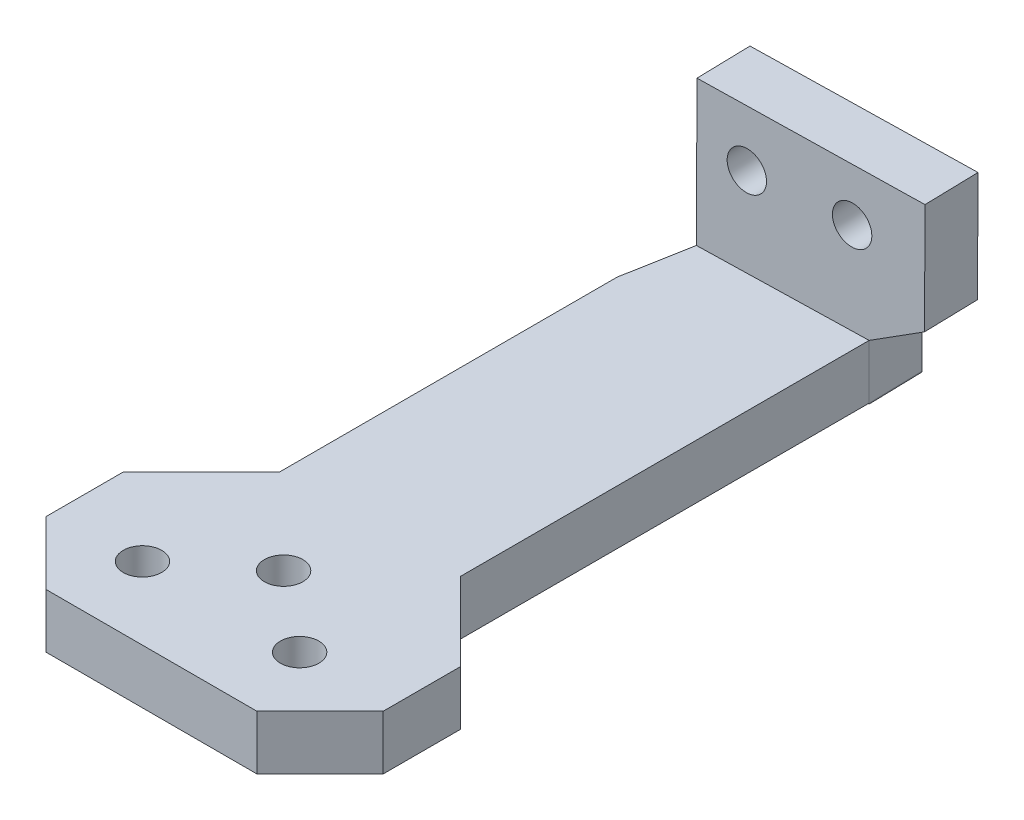
ISO-10303-21;
HEADER;
FILE_DESCRIPTION(('STEP AP214'),'2;1');
FILE_NAME('part.step','',(''),(''),'','','');
FILE_SCHEMA(('AUTOMOTIVE_DESIGN { 1 0 10303 214 1 1 1 1 }'));
ENDSEC;
DATA;
#1=APPLICATION_CONTEXT('core data for automotive mechanical design processes');
#2=APPLICATION_PROTOCOL_DEFINITION('international standard','automotive_design',2000,#1);
#3=PRODUCT_CONTEXT('',#1,'mechanical');
#4=PRODUCT('Part','Part','',(#3));
#5=PRODUCT_RELATED_PRODUCT_CATEGORY('part','',(#4));
#6=PRODUCT_DEFINITION_FORMATION('','',#4);
#7=PRODUCT_DEFINITION_CONTEXT('part definition',#1,'design');
#8=PRODUCT_DEFINITION('design','',#6,#7);
#9=PRODUCT_DEFINITION_SHAPE('','',#8);
#10=(LENGTH_UNIT() NAMED_UNIT(*) SI_UNIT(.MILLI.,.METRE.));
#11=(NAMED_UNIT(*) PLANE_ANGLE_UNIT() SI_UNIT($,.RADIAN.));
#12=(NAMED_UNIT(*) SI_UNIT($,.STERADIAN.) SOLID_ANGLE_UNIT());
#13=UNCERTAINTY_MEASURE_WITH_UNIT(LENGTH_MEASURE(1.E-05),#10,'distance_accuracy_value','');
#14=(GEOMETRIC_REPRESENTATION_CONTEXT(3) GLOBAL_UNCERTAINTY_ASSIGNED_CONTEXT((#13)) GLOBAL_UNIT_ASSIGNED_CONTEXT((#10,
#11,#12)) REPRESENTATION_CONTEXT('',''));
#15=CARTESIAN_POINT('',(0.,0.,0.));
#16=DIRECTION('',(0.,0.,1.));
#17=DIRECTION('',(1.,0.,0.));
#18=AXIS2_PLACEMENT_3D('',#15,#16,#17);
#19=CARTESIAN_POINT('',(0.5975916541765,0.,24.3393126845238));
#20=DIRECTION('',(-0.0245451308027947,0.,-0.999698722892989));
#21=DIRECTION('',(-0.999698722892989,0.,0.0245451308027947));
#22=AXIS2_PLACEMENT_3D('',#19,#20,#21);
#23=PLANE('',#22);
#24=CARTESIAN_POINT('',(-3.38225333063673,16.7282372679157,24.4370279396203));
#25=DIRECTION('',(0.0245451308027946,0.,0.999698722892989));
#26=DIRECTION('',(0.999698722892989,0.,-0.0245451308027946));
#27=AXIS2_PLACEMENT_3D('',#24,#25,#26);
#28=CIRCLE('',#27,2.24790000000673);
#29=CARTESIAN_POINT('',(-1.13503057143885,16.7282372679157,24.3818529400885));
#30=VERTEX_POINT('',#29);
#31=EDGE_CURVE('E403',#30,#30,#28,.T.);
#32=ORIENTED_EDGE('',*,*,#31,.F.);
#33=EDGE_LOOP('',(#32));
#34=FACE_BOUND('',#33,.T.);
#35=CARTESIAN_POINT('',(8.62803223379969,17.0846353252613,24.1421450680038));
#36=DIRECTION('',(0.0245451308027946,0.,0.999698722892989));
#37=DIRECTION('',(0.999698722892989,0.,-0.0245451308027946));
#38=AXIS2_PLACEMENT_3D('',#35,#36,#37);
#39=CIRCLE('',#38,2.24790000000672);
#40=CARTESIAN_POINT('',(10.8752549929976,17.0846353252613,24.086970068472));
#41=VERTEX_POINT('',#40);
#42=EDGE_CURVE('E406',#41,#41,#39,.T.);
#43=ORIENTED_EDGE('',*,*,#42,.F.);
#44=EDGE_LOOP('',(#43));
#45=FACE_BOUND('',#44,.T.);
#46=DIRECTION('',(-0.999698722892989,0.,0.0245451308027947));
#47=VECTOR('',#46,1.);
#48=CARTESIAN_POINT('',(0.597591654176501,6.35,24.3393126845238));
#49=LINE('',#48,#47);
#50=CARTESIAN_POINT('',(10.5664845459525,6.35,24.0945511634932));
#51=VERTEX_POINT('',#50);
#52=CARTESIAN_POINT('',(-9.14070594421671,6.35,24.578412508176));
#53=VERTEX_POINT('',#52);
#54=EDGE_CURVE('E200',#51,#53,#49,.T.);
#55=ORIENTED_EDGE('',*,*,#54,.F.);
#56=DIRECTION('',(-0.847962118438704,-0.529647797487237,0.0208196135858428));
#57=VECTOR('',#56,1.);
#58=CARTESIAN_POINT('',(10.5664845459525,6.35,24.0945511634932));
#59=LINE('',#58,#57);
#60=CARTESIAN_POINT('',(16.8839683571341,10.2959797949635,23.9394409658515));
#61=VERTEX_POINT('',#60);
#62=EDGE_CURVE('E168',#61,#51,#59,.T.);
#63=ORIENTED_EDGE('',*,*,#62,.F.);
#64=DIRECTION('',(0.00439645934331877,0.99999032969989,-0.000107944190764413));
#65=VECTOR('',#64,1.);
#66=CARTESIAN_POINT('',(16.9407170912385,23.203681401112,23.9380476409732));
#67=LINE('',#66,#65);
#68=CARTESIAN_POINT('',(16.9407170912385,23.203681401112,23.9380476409732));
#69=VERTEX_POINT('',#68);
#70=EDGE_CURVE('E305',#61,#69,#67,.T.);
#71=ORIENTED_EDGE('',*,*,#70,.T.);
#72=DIRECTION('',(-0.999689055506319,0.00439778429504862,0.0245448934440134));
#73=VECTOR('',#72,1.);
#74=CARTESIAN_POINT('',(16.9407170912385,23.203681401112,23.9380476409732));
#75=LINE('',#74,#73);
#76=CARTESIAN_POINT('',(-9.06610570774999,23.3180893725102,24.5765808837876));
#77=VERTEX_POINT('',#76);
#78=EDGE_CURVE('E373',#69,#77,#75,.T.);
#79=ORIENTED_EDGE('',*,*,#78,.T.);
#80=DIRECTION('',(-0.00439645934331877,-0.99999032969989,0.000107944190764562));
#81=VECTOR('',#80,1.);
#82=CARTESIAN_POINT('',(-9.06610570774999,23.3180893725102,24.5765808837876));
#83=LINE('',#82,#81);
#84=EDGE_CURVE('E288',#77,#53,#83,.T.);
#85=ORIENTED_EDGE('',*,*,#84,.T.);
#86=EDGE_LOOP('',(#55,#63,#71,#79,#85));
#87=FACE_BOUND('',#86,.T.);
#88=ADVANCED_FACE('F39',(#34,#45,#87),#23,.F.);
#89=CARTESIAN_POINT('',(0.,6.35,0.));
#90=DIRECTION('',(0.,1.,0.));
#91=DIRECTION('',(0.,0.,1.));
#92=AXIS2_PLACEMENT_3D('',#89,#90,#91);
#93=PLANE('',#92);
#94=DIRECTION('',(0.179140165281254,0.,-0.98382356201862));
#95=VECTOR('',#94,1.);
#96=CARTESIAN_POINT('',(-9.14070594421671,6.35,24.578412508176));
#97=LINE('',#96,#95);
#98=CARTESIAN_POINT('',(-10.5664845459524,6.35,32.4086753663532));
#99=VERTEX_POINT('',#98);
#100=EDGE_CURVE('E350',#99,#53,#97,.T.);
#101=ORIENTED_EDGE('',*,*,#100,.F.);
#102=DIRECTION('',(0.,0.,1.));
#103=VECTOR('',#102,1.);
#104=CARTESIAN_POINT('',(-10.5664845459524,6.35,21.8784368138053));
#105=LINE('',#104,#103);
#106=CARTESIAN_POINT('',(-10.5664845459524,6.35,71.843509550559));
#107=VERTEX_POINT('',#106);
#108=EDGE_CURVE('E216',#99,#107,#105,.T.);
#109=ORIENTED_EDGE('',*,*,#108,.T.);
#110=DIRECTION('',(-0.707106781186548,0.,0.707106781186547));
#111=VECTOR('',#110,1.);
#112=CARTESIAN_POINT('',(-10.5664845459524,6.35,71.843509550559));
#113=LINE('',#112,#111);
#114=CARTESIAN_POINT('',(-19.6998793715268,6.35,80.9769043761334));
#115=VERTEX_POINT('',#114);
#116=EDGE_CURVE('E218',#107,#115,#113,.T.);
#117=ORIENTED_EDGE('',*,*,#116,.T.);
#118=DIRECTION('',(0.,0.,1.));
#119=VECTOR('',#118,1.);
#120=CARTESIAN_POINT('',(-19.6998793715268,6.35,-14.5616917387912));
#121=LINE('',#120,#119);
#122=CARTESIAN_POINT('',(-19.6998793715268,6.35,90.0191075086382));
#123=VERTEX_POINT('',#122);
#124=EDGE_CURVE('E267',#115,#123,#121,.T.);
#125=ORIENTED_EDGE('',*,*,#124,.T.);
#126=DIRECTION('',(0.707106781186548,0.,0.707106781186548));
#127=VECTOR('',#126,1.);
#128=CARTESIAN_POINT('',(-12.3270420752059,6.35,97.3919448049591));
#129=LINE('',#128,#127);
#130=CARTESIAN_POINT('',(-12.3270420752059,6.35,97.3919448049591));
#131=VERTEX_POINT('',#130);
#132=EDGE_CURVE('E221',#123,#131,#129,.T.);
#133=ORIENTED_EDGE('',*,*,#132,.T.);
#134=DIRECTION('',(1.,0.,0.));
#135=VECTOR('',#134,1.);
#136=CARTESIAN_POINT('',(-19.6998793715268,6.35,97.3919448049591));
#137=LINE('',#136,#135);
#138=CARTESIAN_POINT('',(12.3270420752059,6.35,97.3919448049591));
#139=VERTEX_POINT('',#138);
#140=EDGE_CURVE('E270',#131,#139,#137,.T.);
#141=ORIENTED_EDGE('',*,*,#140,.T.);
#142=DIRECTION('',(0.707106781186547,0.,-0.707106781186548));
#143=VECTOR('',#142,1.);
#144=CARTESIAN_POINT('',(12.3270420752059,6.35,97.3919448049591));
#145=LINE('',#144,#143);
#146=CARTESIAN_POINT('',(19.6998793715268,6.35,90.0191075086382));
#147=VERTEX_POINT('',#146);
#148=EDGE_CURVE('E224',#139,#147,#145,.T.);
#149=ORIENTED_EDGE('',*,*,#148,.T.);
#150=DIRECTION('',(0.,0.,-1.));
#151=VECTOR('',#150,1.);
#152=CARTESIAN_POINT('',(19.6998793715268,6.35,-14.5616917387912));
#153=LINE('',#152,#151);
#154=CARTESIAN_POINT('',(19.6998793715268,6.35,80.9769043761334));
#155=VERTEX_POINT('',#154);
#156=EDGE_CURVE('E181',#147,#155,#153,.T.);
#157=ORIENTED_EDGE('',*,*,#156,.T.);
#158=DIRECTION('',(-0.707106781186547,0.,-0.707106781186548));
#159=VECTOR('',#158,1.);
#160=CARTESIAN_POINT('',(19.6998793715268,6.35,80.9769043761334));
#161=LINE('',#160,#159);
#162=CARTESIAN_POINT('',(10.5664845459524,6.35,71.843509550559));
#163=VERTEX_POINT('',#162);
#164=EDGE_CURVE('E227',#155,#163,#161,.T.);
#165=ORIENTED_EDGE('',*,*,#164,.T.);
#166=DIRECTION('',(0.,0.,-1.));
#167=VECTOR('',#166,1.);
#168=CARTESIAN_POINT('',(10.5664845459524,6.35,71.843509550559));
#169=LINE('',#168,#167);
#170=EDGE_CURVE('E230',#163,#51,#169,.T.);
#171=ORIENTED_EDGE('',*,*,#170,.T.);
#172=ORIENTED_EDGE('',*,*,#54,.T.);
#173=EDGE_LOOP('',(#101,#109,#117,#125,#133,#141,#149,#157,#165,#171,#172));
#174=FACE_BOUND('',#173,.T.);
#175=CARTESIAN_POINT('',(8.83739968952087,6.35,88.9179733151553));
#176=DIRECTION('',(0.,-1.,0.));
#177=DIRECTION('',(0.,0.,-1.));
#178=AXIS2_PLACEMENT_3D('',#175,#176,#177);
#179=CIRCLE('',#178,2.2479);
#180=CARTESIAN_POINT('',(8.83739968952087,6.35,86.6700733151553));
#181=VERTEX_POINT('',#180);
#182=EDGE_CURVE('E256',#181,#181,#179,.T.);
#183=ORIENTED_EDGE('',*,*,#182,.T.);
#184=EDGE_LOOP('',(#183));
#185=FACE_BOUND('',#184,.T.);
#186=CARTESIAN_POINT('',(-0.345903119202115,6.35,81.6070978447811));
#187=DIRECTION('',(0.,-1.,0.));
#188=DIRECTION('',(0.,0.,-1.));
#189=AXIS2_PLACEMENT_3D('',#186,#187,#188);
#190=CIRCLE('',#189,2.2479);
#191=CARTESIAN_POINT('',(-0.345903119202115,6.35,79.3591978447811));
#192=VERTEX_POINT('',#191);
#193=EDGE_CURVE('E249',#192,#192,#190,.T.);
#194=ORIENTED_EDGE('',*,*,#193,.T.);
#195=EDGE_LOOP('',(#194));
#196=FACE_BOUND('',#195,.T.);
#197=CARTESIAN_POINT('',(-9.52920592792509,6.35,88.9179733151553));
#198=DIRECTION('',(0.,-1.,0.));
#199=DIRECTION('',(0.,0.,-1.));
#200=AXIS2_PLACEMENT_3D('',#197,#198,#199);
#201=CIRCLE('',#200,2.2479);
#202=CARTESIAN_POINT('',(-9.52920592792509,6.35,86.6700733151553));
#203=VERTEX_POINT('',#202);
#204=EDGE_CURVE('E261',#203,#203,#201,.T.);
#205=ORIENTED_EDGE('',*,*,#204,.T.);
#206=EDGE_LOOP('',(#205));
#207=FACE_BOUND('',#206,.T.);
#208=ADVANCED_FACE('F331',(#174,#185,#196,#207),#93,.T.);
#209=CARTESIAN_POINT('',(0.,0.,0.));
#210=DIRECTION('',(0.,1.,0.));
#211=DIRECTION('',(0.,0.,1.));
#212=AXIS2_PLACEMENT_3D('',#209,#210,#211);
#213=PLANE('',#212);
#214=CARTESIAN_POINT('',(-9.52920592792509,0.,88.9179733151553));
#215=DIRECTION('',(0.,-1.,0.));
#216=DIRECTION('',(0.,0.,-1.));
#217=AXIS2_PLACEMENT_3D('',#214,#215,#216);
#218=CIRCLE('',#217,2.2479);
#219=CARTESIAN_POINT('',(-9.52920592792509,0.,86.6700733151553));
#220=VERTEX_POINT('',#219);
#221=EDGE_CURVE('E252',#220,#220,#218,.T.);
#222=ORIENTED_EDGE('',*,*,#221,.F.);
#223=EDGE_LOOP('',(#222));
#224=FACE_BOUND('',#223,.T.);
#225=CARTESIAN_POINT('',(-0.345903119202115,0.,81.6070978447811));
#226=DIRECTION('',(0.,-1.,0.));
#227=DIRECTION('',(0.,0.,-1.));
#228=AXIS2_PLACEMENT_3D('',#225,#226,#227);
#229=CIRCLE('',#228,2.2479);
#230=CARTESIAN_POINT('',(-0.345903119202115,0.,79.3591978447811));
#231=VERTEX_POINT('',#230);
#232=EDGE_CURVE('E253',#231,#231,#229,.T.);
#233=ORIENTED_EDGE('',*,*,#232,.F.);
#234=EDGE_LOOP('',(#233));
#235=FACE_BOUND('',#234,.T.);
#236=CARTESIAN_POINT('',(8.83739968952087,0.,88.9179733151553));
#237=DIRECTION('',(0.,-1.,0.));
#238=DIRECTION('',(0.,0.,-1.));
#239=AXIS2_PLACEMENT_3D('',#236,#237,#238);
#240=CIRCLE('',#239,2.2479);
#241=CARTESIAN_POINT('',(8.83739968952087,0.,86.6700733151553));
#242=VERTEX_POINT('',#241);
#243=EDGE_CURVE('E234',#242,#242,#240,.T.);
#244=ORIENTED_EDGE('',*,*,#243,.F.);
#245=EDGE_LOOP('',(#244));
#246=FACE_BOUND('',#245,.T.);
#247=DIRECTION('',(0.,0.,1.));
#248=VECTOR('',#247,1.);
#249=CARTESIAN_POINT('',(-10.5664845459524,0.,21.8784368138053));
#250=LINE('',#249,#248);
#251=CARTESIAN_POINT('',(-10.5664845459524,0.,32.4086753663532));
#252=VERTEX_POINT('',#251);
#253=CARTESIAN_POINT('',(-10.5664845459524,0.,71.843509550559));
#254=VERTEX_POINT('',#253);
#255=EDGE_CURVE('E232',#252,#254,#250,.T.);
#256=ORIENTED_EDGE('',*,*,#255,.F.);
#257=DIRECTION('',(0.179140165281254,0.,-0.98382356201862));
#258=VECTOR('',#257,1.);
#259=CARTESIAN_POINT('',(-4.51561340049107,0.,-0.822228458576912));
#260=LINE('',#259,#258);
#261=CARTESIAN_POINT('',(-9.14070594421671,-6.14072964439521E-05,24.578412508176));
#262=VERTEX_POINT('',#261);
#263=EDGE_CURVE('E199',#252,#262,#260,.T.);
#264=ORIENTED_EDGE('',*,*,#263,.T.);
#265=DIRECTION('',(-0.999698722892989,0.,0.0245451308027947));
#266=VECTOR('',#265,1.);
#267=CARTESIAN_POINT('',(0.597591654176501,0.,24.3393126845238));
#268=LINE('',#267,#266);
#269=CARTESIAN_POINT('',(10.5664845459525,0.,24.0945511634932));
#270=VERTEX_POINT('',#269);
#271=EDGE_CURVE('E188',#270,#262,#268,.T.);
#272=ORIENTED_EDGE('',*,*,#271,.F.);
#273=DIRECTION('',(0.,0.,-1.));
#274=VECTOR('',#273,1.);
#275=CARTESIAN_POINT('',(10.5664845459524,0.,71.843509550559));
#276=LINE('',#275,#274);
#277=CARTESIAN_POINT('',(10.5664845459524,0.,71.843509550559));
#278=VERTEX_POINT('',#277);
#279=EDGE_CURVE('E198',#278,#270,#276,.T.);
#280=ORIENTED_EDGE('',*,*,#279,.F.);
#281=DIRECTION('',(-0.707106781186547,0.,-0.707106781186548));
#282=VECTOR('',#281,1.);
#283=CARTESIAN_POINT('',(19.6998793715268,0.,80.9769043761334));
#284=LINE('',#283,#282);
#285=CARTESIAN_POINT('',(19.6998793715268,0.,80.9769043761334));
#286=VERTEX_POINT('',#285);
#287=EDGE_CURVE('E207',#286,#278,#284,.T.);
#288=ORIENTED_EDGE('',*,*,#287,.F.);
#289=DIRECTION('',(0.,0.,-1.));
#290=VECTOR('',#289,1.);
#291=CARTESIAN_POINT('',(19.6998793715268,0.,-14.5616917387912));
#292=LINE('',#291,#290);
#293=CARTESIAN_POINT('',(19.6998793715268,0.,90.0191075086382));
#294=VERTEX_POINT('',#293);
#295=EDGE_CURVE('E271',#294,#286,#292,.T.);
#296=ORIENTED_EDGE('',*,*,#295,.F.);
#297=DIRECTION('',(0.707106781186547,0.,-0.707106781186548));
#298=VECTOR('',#297,1.);
#299=CARTESIAN_POINT('',(12.3270420752059,0.,97.3919448049591));
#300=LINE('',#299,#298);
#301=CARTESIAN_POINT('',(12.3270420752059,0.,97.3919448049591));
#302=VERTEX_POINT('',#301);
#303=EDGE_CURVE('E212',#302,#294,#300,.T.);
#304=ORIENTED_EDGE('',*,*,#303,.F.);
#305=DIRECTION('',(1.,0.,0.));
#306=VECTOR('',#305,1.);
#307=CARTESIAN_POINT('',(-19.6998793715268,0.,97.3919448049591));
#308=LINE('',#307,#306);
#309=CARTESIAN_POINT('',(-12.3270420752059,0.,97.3919448049591));
#310=VERTEX_POINT('',#309);
#311=EDGE_CURVE('E278',#310,#302,#308,.T.);
#312=ORIENTED_EDGE('',*,*,#311,.F.);
#313=DIRECTION('',(0.707106781186548,0.,0.707106781186548));
#314=VECTOR('',#313,1.);
#315=CARTESIAN_POINT('',(-12.3270420752059,0.,97.3919448049591));
#316=LINE('',#315,#314);
#317=CARTESIAN_POINT('',(-19.6998793715268,0.,90.0191075086382));
#318=VERTEX_POINT('',#317);
#319=EDGE_CURVE('E317',#318,#310,#316,.T.);
#320=ORIENTED_EDGE('',*,*,#319,.F.);
#321=DIRECTION('',(0.,0.,1.));
#322=VECTOR('',#321,1.);
#323=CARTESIAN_POINT('',(-19.6998793715268,0.,-14.5616917387912));
#324=LINE('',#323,#322);
#325=CARTESIAN_POINT('',(-19.6998793715268,0.,80.9769043761334));
#326=VERTEX_POINT('',#325);
#327=EDGE_CURVE('E264',#326,#318,#324,.T.);
#328=ORIENTED_EDGE('',*,*,#327,.F.);
#329=DIRECTION('',(-0.707106781186548,0.,0.707106781186547));
#330=VECTOR('',#329,1.);
#331=CARTESIAN_POINT('',(-10.5664845459524,0.,71.843509550559));
#332=LINE('',#331,#330);
#333=EDGE_CURVE('E315',#254,#326,#332,.T.);
#334=ORIENTED_EDGE('',*,*,#333,.F.);
#335=EDGE_LOOP('',(#256,#264,#272,#280,#288,#296,#304,#312,#320,#328,#334));
#336=FACE_BOUND('',#335,.T.);
#337=ADVANCED_FACE('F196',(#224,#235,#246,#336),#213,.F.);
#338=CARTESIAN_POINT('',(10.5664845459524,0.,71.843509550559));
#339=DIRECTION('',(1.,0.,0.));
#340=DIRECTION('',(0.,0.,-1.));
#341=AXIS2_PLACEMENT_3D('',#338,#339,#340);
#342=PLANE('',#341);
#343=ORIENTED_EDGE('',*,*,#279,.T.);
#344=DIRECTION('',(0.,1.,0.));
#345=VECTOR('',#344,1.);
#346=CARTESIAN_POINT('',(10.5664845459524,0.,24.0945511634931));
#347=LINE('',#346,#345);
#348=EDGE_CURVE('E171',#270,#51,#347,.T.);
#349=ORIENTED_EDGE('',*,*,#348,.T.);
#350=ORIENTED_EDGE('',*,*,#170,.F.);
#351=DIRECTION('',(0.,1.,0.));
#352=VECTOR('',#351,1.);
#353=CARTESIAN_POINT('',(10.5664845459524,0.,71.843509550559));
#354=LINE('',#353,#352);
#355=EDGE_CURVE('E204',#278,#163,#354,.T.);
#356=ORIENTED_EDGE('',*,*,#355,.F.);
#357=EDGE_LOOP('',(#343,#349,#350,#356));
#358=FACE_BOUND('',#357,.T.);
#359=ADVANCED_FACE('F203',(#358),#342,.T.);
#360=CARTESIAN_POINT('',(-19.6998793715268,6.35,-14.5616917387912));
#361=DIRECTION('',(1.,0.,0.));
#362=DIRECTION('',(0.,0.,-1.));
#363=AXIS2_PLACEMENT_3D('',#360,#361,#362);
#364=PLANE('',#363);
#365=DIRECTION('',(0.,1.,0.));
#366=VECTOR('',#365,1.);
#367=CARTESIAN_POINT('',(-19.6998793715268,0.,90.0191075086382));
#368=LINE('',#367,#366);
#369=EDGE_CURVE('E245',#318,#123,#368,.T.);
#370=ORIENTED_EDGE('',*,*,#369,.T.);
#371=ORIENTED_EDGE('',*,*,#124,.F.);
#372=DIRECTION('',(0.,1.,0.));
#373=VECTOR('',#372,1.);
#374=CARTESIAN_POINT('',(-19.6998793715268,0.,80.9769043761334));
#375=LINE('',#374,#373);
#376=EDGE_CURVE('E210',#326,#115,#375,.T.);
#377=ORIENTED_EDGE('',*,*,#376,.F.);
#378=ORIENTED_EDGE('',*,*,#327,.T.);
#379=EDGE_LOOP('',(#370,#371,#377,#378));
#380=FACE_BOUND('',#379,.T.);
#381=ADVANCED_FACE('F41',(#380),#364,.F.);
#382=CARTESIAN_POINT('',(-19.6998793715268,6.35,97.3919448049591));
#383=DIRECTION('',(0.,0.,-1.));
#384=DIRECTION('',(-1.,0.,0.));
#385=AXIS2_PLACEMENT_3D('',#382,#383,#384);
#386=PLANE('',#385);
#387=DIRECTION('',(0.,1.,0.));
#388=VECTOR('',#387,1.);
#389=CARTESIAN_POINT('',(12.3270420752059,0.,97.3919448049591));
#390=LINE('',#389,#388);
#391=EDGE_CURVE('E240',#302,#139,#390,.T.);
#392=ORIENTED_EDGE('',*,*,#391,.T.);
#393=ORIENTED_EDGE('',*,*,#140,.F.);
#394=DIRECTION('',(0.,1.,0.));
#395=VECTOR('',#394,1.);
#396=CARTESIAN_POINT('',(-12.3270420752059,0.,97.3919448049591));
#397=LINE('',#396,#395);
#398=EDGE_CURVE('E243',#310,#131,#397,.T.);
#399=ORIENTED_EDGE('',*,*,#398,.F.);
#400=ORIENTED_EDGE('',*,*,#311,.T.);
#401=EDGE_LOOP('',(#392,#393,#399,#400));
#402=FACE_BOUND('',#401,.T.);
#403=ADVANCED_FACE('F335',(#402),#386,.F.);
#404=CARTESIAN_POINT('',(19.6998793715268,6.35,-14.5616917387912));
#405=DIRECTION('',(-1.,0.,0.));
#406=DIRECTION('',(0.,0.,1.));
#407=AXIS2_PLACEMENT_3D('',#404,#405,#406);
#408=PLANE('',#407);
#409=DIRECTION('',(0.,1.,0.));
#410=VECTOR('',#409,1.);
#411=CARTESIAN_POINT('',(19.6998793715268,0.,80.9769043761334));
#412=LINE('',#411,#410);
#413=EDGE_CURVE('E235',#286,#155,#412,.T.);
#414=ORIENTED_EDGE('',*,*,#413,.T.);
#415=ORIENTED_EDGE('',*,*,#156,.F.);
#416=DIRECTION('',(0.,1.,0.));
#417=VECTOR('',#416,1.);
#418=CARTESIAN_POINT('',(19.6998793715268,0.,90.0191075086382));
#419=LINE('',#418,#417);
#420=EDGE_CURVE('E238',#294,#147,#419,.T.);
#421=ORIENTED_EDGE('',*,*,#420,.F.);
#422=ORIENTED_EDGE('',*,*,#295,.T.);
#423=EDGE_LOOP('',(#414,#415,#421,#422));
#424=FACE_BOUND('',#423,.T.);
#425=ADVANCED_FACE('F326',(#424),#408,.F.);
#426=CARTESIAN_POINT('',(-9.52920592792509,6.35,88.9179733151553));
#427=DIRECTION('',(0.,-1.,0.));
#428=DIRECTION('',(0.,0.,-1.));
#429=AXIS2_PLACEMENT_3D('',#426,#427,#428);
#430=CYLINDRICAL_SURFACE('',#429,2.2479);
#431=ORIENTED_EDGE('',*,*,#204,.F.);
#432=EDGE_LOOP('',(#431));
#433=FACE_BOUND('',#432,.T.);
#434=ORIENTED_EDGE('',*,*,#221,.T.);
#435=EDGE_LOOP('',(#434));
#436=FACE_BOUND('',#435,.T.);
#437=ADVANCED_FACE('F622',(#433,#436),#430,.F.);
#438=CARTESIAN_POINT('',(-0.345903119202115,6.35,81.6070978447811));
#439=DIRECTION('',(0.,-1.,0.));
#440=DIRECTION('',(0.,0.,-1.));
#441=AXIS2_PLACEMENT_3D('',#438,#439,#440);
#442=CYLINDRICAL_SURFACE('',#441,2.2479);
#443=ORIENTED_EDGE('',*,*,#193,.F.);
#444=EDGE_LOOP('',(#443));
#445=FACE_BOUND('',#444,.T.);
#446=ORIENTED_EDGE('',*,*,#232,.T.);
#447=EDGE_LOOP('',(#446));
#448=FACE_BOUND('',#447,.T.);
#449=ADVANCED_FACE('F628',(#445,#448),#442,.F.);
#450=CARTESIAN_POINT('',(8.83739968952087,6.35,88.9179733151553));
#451=DIRECTION('',(0.,-1.,0.));
#452=DIRECTION('',(0.,0.,-1.));
#453=AXIS2_PLACEMENT_3D('',#450,#451,#452);
#454=CYLINDRICAL_SURFACE('',#453,2.2479);
#455=ORIENTED_EDGE('',*,*,#182,.F.);
#456=EDGE_LOOP('',(#455));
#457=FACE_BOUND('',#456,.T.);
#458=ORIENTED_EDGE('',*,*,#243,.T.);
#459=EDGE_LOOP('',(#458));
#460=FACE_BOUND('',#459,.T.);
#461=ADVANCED_FACE('F605',(#457,#460),#454,.F.);
#462=CARTESIAN_POINT('',(-10.5664845459524,0.,21.8784368138053));
#463=DIRECTION('',(-1.,0.,0.));
#464=DIRECTION('',(0.,0.,1.));
#465=AXIS2_PLACEMENT_3D('',#462,#463,#464);
#466=PLANE('',#465);
#467=DIRECTION('',(0.,1.,0.));
#468=VECTOR('',#467,1.);
#469=CARTESIAN_POINT('',(-10.5664845459524,-11.43,32.4086753663532));
#470=LINE('',#469,#468);
#471=EDGE_CURVE('E354',#252,#99,#470,.T.);
#472=ORIENTED_EDGE('',*,*,#471,.F.);
#473=ORIENTED_EDGE('',*,*,#255,.T.);
#474=DIRECTION('',(0.,1.,0.));
#475=VECTOR('',#474,1.);
#476=CARTESIAN_POINT('',(-10.5664845459524,0.,71.843509550559));
#477=LINE('',#476,#475);
#478=EDGE_CURVE('E206',#254,#107,#477,.T.);
#479=ORIENTED_EDGE('',*,*,#478,.T.);
#480=ORIENTED_EDGE('',*,*,#108,.F.);
#481=EDGE_LOOP('',(#472,#473,#479,#480));
#482=FACE_BOUND('',#481,.T.);
#483=ADVANCED_FACE('F353',(#482),#466,.T.);
#484=CARTESIAN_POINT('',(-10.5664845459524,0.,71.843509550559));
#485=DIRECTION('',(-0.707106781186547,0.,-0.707106781186548));
#486=DIRECTION('',(-0.707106781186548,0.,0.707106781186547));
#487=AXIS2_PLACEMENT_3D('',#484,#485,#486);
#488=PLANE('',#487);
#489=ORIENTED_EDGE('',*,*,#116,.F.);
#490=ORIENTED_EDGE('',*,*,#478,.F.);
#491=ORIENTED_EDGE('',*,*,#333,.T.);
#492=ORIENTED_EDGE('',*,*,#376,.T.);
#493=EDGE_LOOP('',(#489,#490,#491,#492));
#494=FACE_BOUND('',#493,.T.);
#495=ADVANCED_FACE('F346',(#494),#488,.T.);
#496=CARTESIAN_POINT('',(-12.3270420752059,0.,97.3919448049591));
#497=DIRECTION('',(-0.707106781186548,0.,0.707106781186548));
#498=DIRECTION('',(0.707106781186548,0.,0.707106781186548));
#499=AXIS2_PLACEMENT_3D('',#496,#497,#498);
#500=PLANE('',#499);
#501=ORIENTED_EDGE('',*,*,#132,.F.);
#502=ORIENTED_EDGE('',*,*,#369,.F.);
#503=ORIENTED_EDGE('',*,*,#319,.T.);
#504=ORIENTED_EDGE('',*,*,#398,.T.);
#505=EDGE_LOOP('',(#501,#502,#503,#504));
#506=FACE_BOUND('',#505,.T.);
#507=ADVANCED_FACE('F586',(#506),#500,.T.);
#508=CARTESIAN_POINT('',(12.3270420752059,0.,97.3919448049591));
#509=DIRECTION('',(0.707106781186548,0.,0.707106781186547));
#510=DIRECTION('',(0.707106781186547,0.,-0.707106781186548));
#511=AXIS2_PLACEMENT_3D('',#508,#509,#510);
#512=PLANE('',#511);
#513=ORIENTED_EDGE('',*,*,#148,.F.);
#514=ORIENTED_EDGE('',*,*,#391,.F.);
#515=ORIENTED_EDGE('',*,*,#303,.T.);
#516=ORIENTED_EDGE('',*,*,#420,.T.);
#517=EDGE_LOOP('',(#513,#514,#515,#516));
#518=FACE_BOUND('',#517,.T.);
#519=ADVANCED_FACE('F321',(#518),#512,.T.);
#520=CARTESIAN_POINT('',(19.6998793715268,0.,80.9769043761334));
#521=DIRECTION('',(0.707106781186548,0.,-0.707106781186547));
#522=DIRECTION('',(-0.707106781186547,0.,-0.707106781186548));
#523=AXIS2_PLACEMENT_3D('',#520,#521,#522);
#524=PLANE('',#523);
#525=ORIENTED_EDGE('',*,*,#164,.F.);
#526=ORIENTED_EDGE('',*,*,#413,.F.);
#527=ORIENTED_EDGE('',*,*,#287,.T.);
#528=ORIENTED_EDGE('',*,*,#355,.T.);
#529=EDGE_LOOP('',(#525,#526,#527,#528));
#530=FACE_BOUND('',#529,.T.);
#531=ADVANCED_FACE('F328',(#530),#524,.T.);
#532=CARTESIAN_POINT('',(16.9407170912385,23.203681401112,23.9380476409732));
#533=DIRECTION('',(-0.999689055506319,0.00439778429504844,0.0245448934440135));
#534=DIRECTION('',(0.0245451308027947,0.,0.999698722892989));
#535=AXIS2_PLACEMENT_3D('',#532,#533,#534);
#536=PLANE('',#535);
#537=ORIENTED_EDGE('',*,*,#70,.F.);
#538=DIRECTION('',(0.0245451308027945,0.,0.999698722892989));
#539=VECTOR('',#538,1.);
#540=CARTESIAN_POINT('',(16.4475559314604,10.2959797949635,6.1647976728142));
#541=LINE('',#540,#539);
#542=CARTESIAN_POINT('',(16.7281067765363,10.2959797949635,17.5913540754811));
#543=VERTEX_POINT('',#542);
#544=EDGE_CURVE('E167',#543,#61,#541,.T.);
#545=ORIENTED_EDGE('',*,*,#544,.F.);
#546=DIRECTION('',(0.00439645934331877,0.99999032969989,-0.000107944190764413));
#547=VECTOR('',#546,1.);
#548=CARTESIAN_POINT('',(16.7848555106407,23.203681401112,17.5899607506027));
#549=LINE('',#548,#547);
#550=CARTESIAN_POINT('',(16.7848555106407,23.203681401112,17.5899607506027));
#551=VERTEX_POINT('',#550);
#552=EDGE_CURVE('E295',#543,#551,#549,.T.);
#553=ORIENTED_EDGE('',*,*,#552,.T.);
#554=DIRECTION('',(-0.0245451308027946,0.,-0.999698722892989));
#555=VECTOR('',#554,1.);
#556=CARTESIAN_POINT('',(16.9407170912385,23.203681401112,23.9380476409732));
#557=LINE('',#556,#555);
#558=EDGE_CURVE('E201',#69,#551,#557,.T.);
#559=ORIENTED_EDGE('',*,*,#558,.F.);
#560=EDGE_LOOP('',(#537,#545,#553,#559));
#561=FACE_BOUND('',#560,.T.);
#562=ADVANCED_FACE('F418',(#561),#536,.F.);
#563=CARTESIAN_POINT('',(16.9407170912385,23.203681401112,23.9380476409732));
#564=DIRECTION('',(-0.00439645934331895,-0.99999032969989,0.000107944190764538));
#565=DIRECTION('',(0.999990335525808,-0.00439645936893261,0.));
#566=AXIS2_PLACEMENT_3D('',#563,#564,#565);
#567=PLANE('',#566);
#568=DIRECTION('',(-0.999689055506319,0.00439778429504862,0.0245448934440134));
#569=VECTOR('',#568,1.);
#570=CARTESIAN_POINT('',(16.7848555106407,23.203681401112,17.5899607506027));
#571=LINE('',#570,#569);
#572=CARTESIAN_POINT('',(-9.22196728834774,23.3180893725102,18.2284939934171));
#573=VERTEX_POINT('',#572);
#574=EDGE_CURVE('E297',#551,#573,#571,.T.);
#575=ORIENTED_EDGE('',*,*,#574,.T.);
#576=DIRECTION('',(-0.0245451308027946,0.,-0.999698722892989));
#577=VECTOR('',#576,1.);
#578=CARTESIAN_POINT('',(-9.06610570774999,23.3180893725102,24.5765808837876));
#579=LINE('',#578,#577);
#580=EDGE_CURVE('E287',#77,#573,#579,.T.);
#581=ORIENTED_EDGE('',*,*,#580,.F.);
#582=ORIENTED_EDGE('',*,*,#78,.F.);
#583=ORIENTED_EDGE('',*,*,#558,.T.);
#584=EDGE_LOOP('',(#575,#581,#582,#583));
#585=FACE_BOUND('',#584,.T.);
#586=ADVANCED_FACE('F420',(#585),#567,.F.);
#587=CARTESIAN_POINT('',(-9.06610570774999,23.3180893725102,24.5765808837876));
#588=DIRECTION('',(0.999689055506319,-0.00439778429504844,-0.0245448934440135));
#589=DIRECTION('',(-0.0245451308027947,0.,-0.999698722892989));
#590=AXIS2_PLACEMENT_3D('',#587,#588,#589);
#591=PLANE('',#590);
#592=DIRECTION('',(-0.0245451308027947,0.,-0.999698722892989));
#593=VECTOR('',#592,1.);
#594=CARTESIAN_POINT('',(-9.73829759839321,6.35,0.239099823652259));
#595=LINE('',#594,#593);
#596=CARTESIAN_POINT('',(-9.29656752481445,6.35,18.2303256178056));
#597=VERTEX_POINT('',#596);
#598=EDGE_CURVE('E62',#53,#597,#595,.T.);
#599=ORIENTED_EDGE('',*,*,#598,.F.);
#600=ORIENTED_EDGE('',*,*,#84,.F.);
#601=ORIENTED_EDGE('',*,*,#580,.T.);
#602=DIRECTION('',(-0.00439645934331877,-0.99999032969989,0.000107944190764562));
#603=VECTOR('',#602,1.);
#604=CARTESIAN_POINT('',(-9.22196728834774,23.3180893725102,18.2284939934171));
#605=LINE('',#604,#603);
#606=EDGE_CURVE('E299',#573,#597,#605,.T.);
#607=ORIENTED_EDGE('',*,*,#606,.T.);
#608=EDGE_LOOP('',(#599,#600,#601,#607));
#609=FACE_BOUND('',#608,.T.);
#610=ADVANCED_FACE('F382',(#609),#591,.F.);
#611=CARTESIAN_POINT('',(16.8381990679683,-0.114407971398249,23.9405647176015));
#612=DIRECTION('',(0.00439645934331895,0.99999032969989,-0.000107944190764538));
#613=DIRECTION('',(-0.999990335525808,0.00439645936893261,0.));
#614=AXIS2_PLACEMENT_3D('',#611,#612,#613);
#615=PLANE('',#614);
#616=DIRECTION('',(0.999689055506319,-0.00439778429504862,-0.0245448934440136));
#617=VECTOR('',#616,1.);
#618=CARTESIAN_POINT('',(16.6823374873706,-0.11440797139825,17.5924778272311));
#619=LINE('',#618,#617);
#620=CARTESIAN_POINT('',(-9.22196728834774,-0.000450992386302404,18.2284939934171));
#621=VERTEX_POINT('',#620);
#622=CARTESIAN_POINT('',(10.4189352757221,-0.0868543118595751,17.7462601848903));
#623=VERTEX_POINT('',#622);
#624=EDGE_CURVE('E302',#621,#623,#619,.T.);
#625=ORIENTED_EDGE('',*,*,#624,.T.);
#626=DIRECTION('',(0.0245451308027945,0.,0.999698722892989));
#627=VECTOR('',#626,1.);
#628=CARTESIAN_POINT('',(10.5747968563198,-0.0868543118595743,24.0943470752608));
#629=LINE('',#628,#627);
#630=CARTESIAN_POINT('',(10.5747968563198,-0.0868543118595743,24.0943470752608));
#631=VERTEX_POINT('',#630);
#632=EDGE_CURVE('E54',#623,#631,#629,.T.);
#633=ORIENTED_EDGE('',*,*,#632,.T.);
#634=DIRECTION('',(0.999689055506319,-0.00439778429504862,-0.0245448934440136));
#635=VECTOR('',#634,1.);
#636=CARTESIAN_POINT('',(16.8381990679683,-0.114407971398249,23.9405647176015));
#637=LINE('',#636,#635);
#638=EDGE_CURVE('E190',#262,#631,#637,.T.);
#639=ORIENTED_EDGE('',*,*,#638,.F.);
#640=DIRECTION('',(-0.0127961785031248,-5.16779739524786E-05,-0.99991812422073));
#641=VECTOR('',#640,1.);
#642=CARTESIAN_POINT('',(-9.14461352305402,-0.000138595535398899,24.2730667441822));
#643=LINE('',#642,#641);
#644=EDGE_CURVE('E359',#262,#621,#643,.T.);
#645=ORIENTED_EDGE('',*,*,#644,.T.);
#646=EDGE_LOOP('',(#625,#633,#639,#645));
#647=FACE_BOUND('',#646,.T.);
#648=ADVANCED_FACE('F428',(#647),#615,.F.);
#649=ORIENTED_EDGE('',*,*,#638,.T.);
#650=DIRECTION('',(0.0952684989294179,-0.995448864485207,-0.0023390824796108));
#651=VECTOR('',#650,1.);
#652=CARTESIAN_POINT('',(10.5664845459525,0.,24.0945511634932));
#653=LINE('',#652,#651);
#654=EDGE_CURVE('E163',#270,#631,#653,.T.);
#655=ORIENTED_EDGE('',*,*,#654,.F.);
#656=ORIENTED_EDGE('',*,*,#271,.T.);
#657=EDGE_LOOP('',(#649,#655,#656));
#658=FACE_BOUND('',#657,.T.);
#659=ADVANCED_FACE('F187',(#658),#23,.F.);
#660=CARTESIAN_POINT('',(0.441730073578754,0.,17.9912257941533));
#661=DIRECTION('',(-0.0245451308027947,0.,-0.999698722892989));
#662=DIRECTION('',(-0.999698722892989,0.,0.0245451308027947));
#663=AXIS2_PLACEMENT_3D('',#660,#661,#662);
#664=PLANE('',#663);
#665=DIRECTION('',(0.847962118438704,0.529647797487237,-0.0208196135858431));
#666=VECTOR('',#665,1.);
#667=CARTESIAN_POINT('',(0.386351535976181,0.0887140668968627,17.9925854772438));
#668=LINE('',#667,#666);
#669=CARTESIAN_POINT('',(10.4106229653547,6.35,17.7464642731227));
#670=VERTEX_POINT('',#669);
#671=EDGE_CURVE('E11',#670,#543,#668,.T.);
#672=ORIENTED_EDGE('',*,*,#671,.F.);
#673=DIRECTION('',(0.,1.,0.));
#674=VECTOR('',#673,1.);
#675=CARTESIAN_POINT('',(10.4106229653547,0.,17.7464642731227));
#676=LINE('',#675,#674);
#677=CARTESIAN_POINT('',(10.4106229653547,0.,17.7464642731227));
#678=VERTEX_POINT('',#677);
#679=EDGE_CURVE('E47',#678,#670,#676,.T.);
#680=ORIENTED_EDGE('',*,*,#679,.F.);
#681=DIRECTION('',(-0.0952684989294179,0.995448864485208,0.00233908247961101));
#682=VECTOR('',#681,1.);
#683=CARTESIAN_POINT('',(10.3200898844173,0.94596906249506,17.7486870891198));
#684=LINE('',#683,#682);
#685=EDGE_CURVE('E164',#623,#678,#684,.T.);
#686=ORIENTED_EDGE('',*,*,#685,.F.);
#687=ORIENTED_EDGE('',*,*,#624,.F.);
#688=DIRECTION('',(0.,-1.,0.));
#689=VECTOR('',#688,1.);
#690=CARTESIAN_POINT('',(-9.22196728834774,0.,18.2284939934171));
#691=LINE('',#690,#689);
#692=CARTESIAN_POINT('',(-9.22196728834774,6.35,18.2284939934171));
#693=VERTEX_POINT('',#692);
#694=EDGE_CURVE('E284',#693,#621,#691,.T.);
#695=ORIENTED_EDGE('',*,*,#694,.F.);
#696=DIRECTION('',(-0.999698722892989,0.,0.0245451308027947));
#697=VECTOR('',#696,1.);
#698=CARTESIAN_POINT('',(0.441730073578754,6.35,17.9912257941533));
#699=LINE('',#698,#697);
#700=EDGE_CURVE('E180',#693,#597,#699,.T.);
#701=ORIENTED_EDGE('',*,*,#700,.T.);
#702=ORIENTED_EDGE('',*,*,#606,.F.);
#703=ORIENTED_EDGE('',*,*,#574,.F.);
#704=ORIENTED_EDGE('',*,*,#552,.F.);
#705=EDGE_LOOP('',(#672,#680,#686,#687,#695,#701,#702,#703,#704));
#706=FACE_BOUND('',#705,.T.);
#707=CARTESIAN_POINT('',(8.47217065320195,17.0846353252613,17.7940581776333));
#708=DIRECTION('',(-0.0245451308027947,0.,-0.999698722892989));
#709=DIRECTION('',(-0.999698722892989,0.,0.0245451308027947));
#710=AXIS2_PLACEMENT_3D('',#707,#708,#709);
#711=CIRCLE('',#710,2.24790000000672);
#712=CARTESIAN_POINT('',(10.7193934123998,17.0846353252613,17.7388831781015));
#713=VERTEX_POINT('',#712);
#714=EDGE_CURVE('E397',#713,#713,#711,.T.);
#715=ORIENTED_EDGE('',*,*,#714,.F.);
#716=EDGE_LOOP('',(#715));
#717=FACE_BOUND('',#716,.T.);
#718=CARTESIAN_POINT('',(-3.53811491123447,16.7282372679157,18.0889410492498));
#719=DIRECTION('',(-0.0245451308027947,0.,-0.999698722892989));
#720=DIRECTION('',(-0.999698722892989,0.,0.0245451308027947));
#721=AXIS2_PLACEMENT_3D('',#718,#719,#720);
#722=CIRCLE('',#721,2.24790000000673);
#723=CARTESIAN_POINT('',(-1.2908921520366,16.7282372679157,18.033766049718));
#724=VERTEX_POINT('',#723);
#725=EDGE_CURVE('E400',#724,#724,#722,.T.);
#726=ORIENTED_EDGE('',*,*,#725,.F.);
#727=EDGE_LOOP('',(#726));
#728=FACE_BOUND('',#727,.T.);
#729=ADVANCED_FACE('F387',(#706,#717,#728),#664,.T.);
#730=CARTESIAN_POINT('',(-9.14070594421671,-11.43,24.578412508176));
#731=DIRECTION('',(0.98382356201862,0.,0.179140165281254));
#732=DIRECTION('',(0.179140165281254,0.,-0.98382356201862));
#733=AXIS2_PLACEMENT_3D('',#730,#731,#732);
#734=PLANE('',#733);
#735=ORIENTED_EDGE('',*,*,#471,.T.);
#736=ORIENTED_EDGE('',*,*,#100,.T.);
#737=DIRECTION('',(0.,1.,0.));
#738=VECTOR('',#737,1.);
#739=CARTESIAN_POINT('',(-9.14070594421671,-11.43,24.578412508176));
#740=LINE('',#739,#738);
#741=EDGE_CURVE('E356',#262,#53,#740,.T.);
#742=ORIENTED_EDGE('',*,*,#741,.F.);
#743=ORIENTED_EDGE('',*,*,#263,.F.);
#744=EDGE_LOOP('',(#735,#736,#742,#743));
#745=FACE_BOUND('',#744,.T.);
#746=ADVANCED_FACE('F396',(#745),#734,.F.);
#747=CARTESIAN_POINT('',(-9.22196728834774,-11.43,18.2284939934171));
#748=DIRECTION('',(0.999918125555927,0.,-0.0127961785202116));
#749=DIRECTION('',(-0.0127961785202116,0.,-0.999918125555927));
#750=AXIS2_PLACEMENT_3D('',#747,#748,#749);
#751=PLANE('',#750);
#752=ORIENTED_EDGE('',*,*,#741,.T.);
#753=DIRECTION('',(-0.0127961785202116,0.,-0.999918125555927));
#754=VECTOR('',#753,1.);
#755=CARTESIAN_POINT('',(-9.22196728834774,6.35,18.2284939934171));
#756=LINE('',#755,#754);
#757=EDGE_CURVE('E357',#53,#693,#756,.T.);
#758=ORIENTED_EDGE('',*,*,#757,.T.);
#759=ORIENTED_EDGE('',*,*,#694,.T.);
#760=ORIENTED_EDGE('',*,*,#644,.F.);
#761=EDGE_LOOP('',(#752,#758,#759,#760));
#762=FACE_BOUND('',#761,.T.);
#763=ADVANCED_FACE('F394',(#762),#751,.F.);
#764=CARTESIAN_POINT('',(0.,6.35,0.));
#765=DIRECTION('',(0.,-1.,0.));
#766=DIRECTION('',(0.,0.,-1.));
#767=AXIS2_PLACEMENT_3D('',#764,#765,#766);
#768=PLANE('',#767);
#769=ORIENTED_EDGE('',*,*,#598,.T.);
#770=ORIENTED_EDGE('',*,*,#700,.F.);
#771=ORIENTED_EDGE('',*,*,#757,.F.);
#772=EDGE_LOOP('',(#769,#770,#771));
#773=FACE_BOUND('',#772,.T.);
#774=ADVANCED_FACE('F392',(#773),#768,.T.);
#775=CARTESIAN_POINT('',(-3.81866575631041,16.7282372679157,6.66238464658291));
#776=DIRECTION('',(0.0245451308027945,0.,0.999698722892989));
#777=DIRECTION('',(0.999698722892989,0.,-0.0245451308027946));
#778=AXIS2_PLACEMENT_3D('',#775,#776,#777);
#779=CYLINDRICAL_SURFACE('',#778,2.24790000000673);
#780=CARTESIAN_POINT('',(-1.2908921520366,16.7282372679157,18.033766049718));
#781=CARTESIAN_POINT('',(-1.28926859390537,16.7282372679157,18.099891954826));
#782=CARTESIAN_POINT('',(-1.28764503577414,16.7282372679157,18.1660178599341));
#783=CARTESIAN_POINT('',(-1.28439791951169,16.7282372679157,18.2982696701501));
#784=CARTESIAN_POINT('',(-1.28277436138046,16.7282372679157,18.3643955752581));
#785=CARTESIAN_POINT('',(-1.27952724511801,16.7282372679157,18.4966473854742));
#786=CARTESIAN_POINT('',(-1.27790368698678,16.7282372679157,18.5627732905822));
#787=CARTESIAN_POINT('',(-1.27465657072433,16.7282372679157,18.6950251007983));
#788=CARTESIAN_POINT('',(-1.27303301259311,16.7282372679157,18.7611510059063));
#789=CARTESIAN_POINT('',(-1.26978589633065,16.7282372679157,18.8934028161223));
#790=CARTESIAN_POINT('',(-1.26816233819943,16.7282372679157,18.9595287212304));
#791=CARTESIAN_POINT('',(-1.26491522193697,16.7282372679157,19.0917805314464));
#792=CARTESIAN_POINT('',(-1.26329166380575,16.7282372679157,19.1579064365544));
#793=CARTESIAN_POINT('',(-1.26004454754329,16.7282372679157,19.2901582467705));
#794=CARTESIAN_POINT('',(-1.25842098941207,16.7282372679157,19.3562841518785));
#795=CARTESIAN_POINT('',(-1.25517387314961,16.7282372679157,19.4885359620946));
#796=CARTESIAN_POINT('',(-1.25355031501839,16.7282372679157,19.5546618672026));
#797=CARTESIAN_POINT('',(-1.25030319875593,16.7282372679157,19.6869136774187));
#798=CARTESIAN_POINT('',(-1.24867964062471,16.7282372679157,19.7530395825267));
#799=CARTESIAN_POINT('',(-1.24543252436225,16.7282372679157,19.8852913927427));
#800=CARTESIAN_POINT('',(-1.24380896623103,16.7282372679157,19.9514172978508));
#801=CARTESIAN_POINT('',(-1.24056184996857,16.7282372679157,20.0836691080668));
#802=CARTESIAN_POINT('',(-1.23893829183735,16.7282372679157,20.1497950131748));
#803=CARTESIAN_POINT('',(-1.2356911755749,16.7282372679157,20.2820468233909));
#804=CARTESIAN_POINT('',(-1.23406761744367,16.7282372679157,20.3481727284989));
#805=CARTESIAN_POINT('',(-1.23082050118122,16.7282372679157,20.480424538715));
#806=CARTESIAN_POINT('',(-1.22919694304999,16.7282372679157,20.546550443823));
#807=CARTESIAN_POINT('',(-1.22594982678754,16.7282372679157,20.678802254039));
#808=CARTESIAN_POINT('',(-1.22432626865631,16.7282372679157,20.7449281591471));
#809=CARTESIAN_POINT('',(-1.22107915239386,16.7282372679157,20.8771799693631));
#810=CARTESIAN_POINT('',(-1.21945559426263,16.7282372679157,20.9433058744711));
#811=CARTESIAN_POINT('',(-1.21620847800018,16.7282372679157,21.0755576846872));
#812=CARTESIAN_POINT('',(-1.21458491986895,16.7282372679157,21.1416835897952));
#813=CARTESIAN_POINT('',(-1.2113378036065,16.7282372679157,21.2739354000113));
#814=CARTESIAN_POINT('',(-1.20971424547527,16.7282372679157,21.3400613051193));
#815=CARTESIAN_POINT('',(-1.20646712921282,16.7282372679157,21.4723131153354));
#816=CARTESIAN_POINT('',(-1.20484357108159,16.7282372679157,21.5384390204434));
#817=CARTESIAN_POINT('',(-1.20159645481914,16.7282372679157,21.6706908306594));
#818=CARTESIAN_POINT('',(-1.19997289668791,16.7282372679157,21.7368167357675));
#819=CARTESIAN_POINT('',(-1.19672578042546,16.7282372679157,21.8690685459835));
#820=CARTESIAN_POINT('',(-1.19510222229423,16.7282372679157,21.9351944510915));
#821=CARTESIAN_POINT('',(-1.19185510603178,16.7282372679157,22.0674462613076));
#822=CARTESIAN_POINT('',(-1.19023154790055,16.7282372679157,22.1335721664156));
#823=CARTESIAN_POINT('',(-1.1869844316381,16.7282372679157,22.2658239766317));
#824=CARTESIAN_POINT('',(-1.18536087350687,16.7282372679157,22.3319498817397));
#825=CARTESIAN_POINT('',(-1.18211375724442,16.7282372679157,22.4642016919557));
#826=CARTESIAN_POINT('',(-1.18049019911319,16.7282372679157,22.5303275970638));
#827=CARTESIAN_POINT('',(-1.17724308285074,16.7282372679157,22.6625794072798));
#828=CARTESIAN_POINT('',(-1.17561952471951,16.7282372679157,22.7287053123878));
#829=CARTESIAN_POINT('',(-1.17237240845706,16.7282372679157,22.8609571226039));
#830=CARTESIAN_POINT('',(-1.17074885032583,16.7282372679157,22.9270830277119));
#831=CARTESIAN_POINT('',(-1.16750173406338,16.7282372679157,23.059334837928));
#832=CARTESIAN_POINT('',(-1.16587817593216,16.7282372679157,23.125460743036));
#833=CARTESIAN_POINT('',(-1.1626310596697,16.7282372679157,23.2577125532521));
#834=CARTESIAN_POINT('',(-1.16100750153848,16.7282372679157,23.3238384583601));
#835=CARTESIAN_POINT('',(-1.15776038527602,16.7282372679157,23.4560902685761));
#836=CARTESIAN_POINT('',(-1.1561368271448,16.7282372679157,23.5222161736842));
#837=CARTESIAN_POINT('',(-1.15288971088234,16.7282372679157,23.6544679839002));
#838=CARTESIAN_POINT('',(-1.15126615275112,16.7282372679157,23.7205938890082));
#839=CARTESIAN_POINT('',(-1.14801903648866,16.7282372679157,23.8528456992243));
#840=CARTESIAN_POINT('',(-1.14639547835744,16.7282372679157,23.9189716043323));
#841=CARTESIAN_POINT('',(-1.14314836209498,16.7282372679157,24.0512234145484));
#842=CARTESIAN_POINT('',(-1.14152480396376,16.7282372679157,24.1173493196564));
#843=CARTESIAN_POINT('',(-1.1382776877013,16.7282372679157,24.2496011298724));
#844=CARTESIAN_POINT('',(-1.13665412957008,16.7282372679157,24.3157270349805));
#845=CARTESIAN_POINT('',(-1.13503057143885,16.7282372679157,24.3818529400885));
#846=B_SPLINE_CURVE_WITH_KNOTS('',3,(#780,#781,#782,#783,#784,#785,#786,#787,#788,#789,#790,
#791,#792,#793,#794,#795,#796,#797,#798,#799,#800,#801,#802,#803,#804,#805,#806,#807,#808,#809,
#810,#811,#812,#813,#814,#815,#816,#817,#818,#819,#820,#821,#822,#823,#824,#825,#826,#827,#828,
#829,#830,#831,#832,#833,#834,#835,#836,#837,#838,#839,#840,#841,#842,#843,#844,#845),
.UNSPECIFIED.,.F.,.F.,(4,2,2,2,2,2,2,2,2,2,2,2,2,2,2,2,2,2,2,2,2,2,2,2,2,2,2,2,2,2,2,2,4),(0.,
0.1984375,0.396875,0.595312499999999,0.793749999999999,0.992187500000002,1.190625,1.3890625,
1.5875,1.7859375,1.984375,2.1828125,2.38125,2.5796875,2.778125,2.9765625,3.175,3.3734375,
3.57187500000001,3.7703125,3.96875000000001,4.16718750000001,4.365625,4.56406250000001,
4.76250000000001,4.96093750000001,5.15937500000001,5.3578125,5.55625,5.75468750000001,5.953125,
6.1515625,6.35000000000001),.UNSPECIFIED.);
#847=EDGE_CURVE('BSEAM457',#724,#30,#846,.T.);
#848=ORIENTED_EDGE('',*,*,#725,.T.);
#849=ORIENTED_EDGE('',*,*,#31,.T.);
#850=ORIENTED_EDGE('',*,*,#847,.T.);
#851=ORIENTED_EDGE('',*,*,#847,.F.);
#852=EDGE_LOOP('',(#848,#850,#849,#851));
#853=FACE_BOUND('',#852,.T.);
#854=ADVANCED_FACE('F457',(#853),#779,.F.);
#855=CARTESIAN_POINT('',(8.19161980812601,17.0846353252613,6.36750177496643));
#856=DIRECTION('',(0.0245451308027945,0.,0.999698722892989));
#857=DIRECTION('',(0.999698722892989,0.,-0.0245451308027946));
#858=AXIS2_PLACEMENT_3D('',#855,#856,#857);
#859=CYLINDRICAL_SURFACE('',#858,2.24790000000672);
#860=CARTESIAN_POINT('',(10.7193934123998,17.0846353252613,17.7388831781015));
#861=CARTESIAN_POINT('',(10.721016970531,17.0846353252613,17.8050090832096));
#862=CARTESIAN_POINT('',(10.7226405286623,17.0846353252613,17.8711349883176));
#863=CARTESIAN_POINT('',(10.7258876449247,17.0846353252613,18.0033867985336));
#864=CARTESIAN_POINT('',(10.7275112030559,17.0846353252613,18.0695127036417));
#865=CARTESIAN_POINT('',(10.7307583193184,17.0846353252613,18.2017645138577));
#866=CARTESIAN_POINT('',(10.7323818774496,17.0846353252613,18.2678904189657));
#867=CARTESIAN_POINT('',(10.7356289937121,17.0846353252613,18.4001422291818));
#868=CARTESIAN_POINT('',(10.7372525518433,17.0846353252613,18.4662681342898));
#869=CARTESIAN_POINT('',(10.7404996681058,17.0846353252613,18.5985199445059));
#870=CARTESIAN_POINT('',(10.742123226237,17.0846353252613,18.6646458496139));
#871=CARTESIAN_POINT('',(10.7453703424994,17.0846353252613,18.7968976598299));
#872=CARTESIAN_POINT('',(10.7469939006307,17.0846353252613,18.863023564938));
#873=CARTESIAN_POINT('',(10.7502410168931,17.0846353252613,18.995275375154));
#874=CARTESIAN_POINT('',(10.7518645750243,17.0846353252613,19.0614012802621));
#875=CARTESIAN_POINT('',(10.7551116912868,17.0846353252613,19.1936530904781));
#876=CARTESIAN_POINT('',(10.756735249418,17.0846353252613,19.2597789955861));
#877=CARTESIAN_POINT('',(10.7599823656805,17.0846353252613,19.3920308058022));
#878=CARTESIAN_POINT('',(10.7616059238117,17.0846353252613,19.4581567109102));
#879=CARTESIAN_POINT('',(10.7648530400742,17.0846353252613,19.5904085211263));
#880=CARTESIAN_POINT('',(10.7664765982054,17.0846353252613,19.6565344262343));
#881=CARTESIAN_POINT('',(10.7697237144678,17.0846353252613,19.7887862364503));
#882=CARTESIAN_POINT('',(10.7713472725991,17.0846353252613,19.8549121415584));
#883=CARTESIAN_POINT('',(10.7745943888615,17.0846353252613,19.9871639517744));
#884=CARTESIAN_POINT('',(10.7762179469927,17.0846353252613,20.0532898568824));
#885=CARTESIAN_POINT('',(10.7794650632552,17.0846353252613,20.1855416670985));
#886=CARTESIAN_POINT('',(10.7810886213864,17.0846353252613,20.2516675722065));
#887=CARTESIAN_POINT('',(10.7843357376489,17.0846353252613,20.3839193824226));
#888=CARTESIAN_POINT('',(10.7859592957801,17.0846353252613,20.4500452875306));
#889=CARTESIAN_POINT('',(10.7892064120426,17.0846353252613,20.5822970977466));
#890=CARTESIAN_POINT('',(10.7908299701738,17.0846353252613,20.6484230028547));
#891=CARTESIAN_POINT('',(10.7940770864362,17.0846353252613,20.7806748130707));
#892=CARTESIAN_POINT('',(10.7957006445675,17.0846353252613,20.8468007181787));
#893=CARTESIAN_POINT('',(10.7989477608299,17.0846353252613,20.9790525283948));
#894=CARTESIAN_POINT('',(10.8005713189611,17.0846353252613,21.0451784335028));
#895=CARTESIAN_POINT('',(10.8038184352236,17.0846353252613,21.1774302437189));
#896=CARTESIAN_POINT('',(10.8054419933548,17.0846353252613,21.2435561488269));
#897=CARTESIAN_POINT('',(10.8086891096173,17.0846353252613,21.375807959043));
#898=CARTESIAN_POINT('',(10.8103126677485,17.0846353252613,21.441933864151));
#899=CARTESIAN_POINT('',(10.813559784011,17.0846353252613,21.574185674367));
#900=CARTESIAN_POINT('',(10.8151833421422,17.0846353252613,21.6403115794751));
#901=CARTESIAN_POINT('',(10.8184304584046,17.0846353252613,21.7725633896911));
#902=CARTESIAN_POINT('',(10.8200540165359,17.0846353252613,21.8386892947991));
#903=CARTESIAN_POINT('',(10.8233011327983,17.0846353252613,21.9709411050152));
#904=CARTESIAN_POINT('',(10.8249246909295,17.0846353252613,22.0370670101232));
#905=CARTESIAN_POINT('',(10.828171807192,17.0846353252613,22.1693188203393));
#906=CARTESIAN_POINT('',(10.8297953653232,17.0846353252613,22.2354447254473));
#907=CARTESIAN_POINT('',(10.8330424815857,17.0846353252613,22.3676965356633));
#908=CARTESIAN_POINT('',(10.8346660397169,17.0846353252613,22.4338224407714));
#909=CARTESIAN_POINT('',(10.8379131559793,17.0846353252613,22.5660742509874));
#910=CARTESIAN_POINT('',(10.8395367141106,17.0846353252613,22.6322001560954));
#911=CARTESIAN_POINT('',(10.842783830373,17.0846353252613,22.7644519663115));
#912=CARTESIAN_POINT('',(10.8444073885043,17.0846353252613,22.8305778714195));
#913=CARTESIAN_POINT('',(10.8476545047667,17.0846353252613,22.9628296816356));
#914=CARTESIAN_POINT('',(10.8492780628979,17.0846353252613,23.0289555867436));
#915=CARTESIAN_POINT('',(10.8525251791604,17.0846353252613,23.1612073969597));
#916=CARTESIAN_POINT('',(10.8541487372916,17.0846353252613,23.2273333020677));
#917=CARTESIAN_POINT('',(10.8573958535541,17.0846353252613,23.3595851122837));
#918=CARTESIAN_POINT('',(10.8590194116853,17.0846353252613,23.4257110173918));
#919=CARTESIAN_POINT('',(10.8622665279477,17.0846353252613,23.5579628276078));
#920=CARTESIAN_POINT('',(10.863890086079,17.0846353252613,23.6240887327158));
#921=CARTESIAN_POINT('',(10.8671372023414,17.0846353252613,23.7563405429319));
#922=CARTESIAN_POINT('',(10.8687607604727,17.0846353252613,23.8224664480399));
#923=CARTESIAN_POINT('',(10.8720078767351,17.0846353252613,23.954718258256));
#924=CARTESIAN_POINT('',(10.8736314348663,17.0846353252613,24.020844163364));
#925=CARTESIAN_POINT('',(10.8752549929976,17.0846353252613,24.086970068472));
#926=B_SPLINE_CURVE_WITH_KNOTS('',3,(#860,#861,#862,#863,#864,#865,#866,#867,#868,#869,#870,
#871,#872,#873,#874,#875,#876,#877,#878,#879,#880,#881,#882,#883,#884,#885,#886,#887,#888,#889,
#890,#891,#892,#893,#894,#895,#896,#897,#898,#899,#900,#901,#902,#903,#904,#905,#906,#907,#908,
#909,#910,#911,#912,#913,#914,#915,#916,#917,#918,#919,#920,#921,#922,#923,#924,#925),
.UNSPECIFIED.,.F.,.F.,(4,2,2,2,2,2,2,2,2,2,2,2,2,2,2,2,2,2,2,2,2,2,2,2,2,2,2,2,2,2,2,2,4),(0.,
0.1984375,0.396875,0.595312499999999,0.793749999999999,0.992187500000002,1.190625,1.3890625,
1.5875,1.7859375,1.984375,2.1828125,2.38125,2.5796875,2.778125,2.9765625,3.175,3.3734375,
3.57187500000001,3.7703125,3.96875000000001,4.16718750000001,4.365625,4.56406250000001,
4.76250000000001,4.96093750000001,5.15937500000001,5.3578125,5.55625,5.75468750000001,5.953125,
6.1515625,6.35000000000001),.UNSPECIFIED.);
#927=EDGE_CURVE('BSEAM461',#713,#41,#926,.T.);
#928=ORIENTED_EDGE('',*,*,#714,.T.);
#929=ORIENTED_EDGE('',*,*,#42,.T.);
#930=ORIENTED_EDGE('',*,*,#927,.T.);
#931=ORIENTED_EDGE('',*,*,#927,.F.);
#932=EDGE_LOOP('',(#928,#930,#929,#931));
#933=FACE_BOUND('',#932,.T.);
#934=ADVANCED_FACE('F461',(#933),#859,.F.);
#935=CARTESIAN_POINT('',(10.1300721202788,0.,6.3199078704558));
#936=DIRECTION('',(-0.995148958531138,-0.0952972097970917,0.0244334225862827));
#937=DIRECTION('',(0.0953256683824617,-0.995446139651682,0.));
#938=AXIS2_PLACEMENT_3D('',#935,#936,#937);
#939=PLANE('',#938);
#940=ORIENTED_EDGE('',*,*,#685,.T.);
#941=DIRECTION('',(0.0245451308027945,0.,0.999698722892989));
#942=VECTOR('',#941,1.);
#943=CARTESIAN_POINT('',(10.1300721202788,0.,6.3199078704558));
#944=LINE('',#943,#942);
#945=EDGE_CURVE('E159',#678,#270,#944,.T.);
#946=ORIENTED_EDGE('',*,*,#945,.T.);
#947=ORIENTED_EDGE('',*,*,#654,.T.);
#948=ORIENTED_EDGE('',*,*,#632,.F.);
#949=EDGE_LOOP('',(#940,#946,#947,#948));
#950=FACE_BOUND('',#949,.T.);
#951=ADVANCED_FACE('F161',(#950),#939,.F.);
#952=CARTESIAN_POINT('',(10.1300721202788,0.,6.3199078704558));
#953=DIRECTION('',(-0.999698722892989,0.,0.0245451308027945));
#954=DIRECTION('',(0.0245451308027946,0.,0.999698722892989));
#955=AXIS2_PLACEMENT_3D('',#952,#953,#954);
#956=PLANE('',#955);
#957=ORIENTED_EDGE('',*,*,#679,.T.);
#958=DIRECTION('',(0.0245451308027945,0.,0.999698722892989));
#959=VECTOR('',#958,1.);
#960=CARTESIAN_POINT('',(10.1300721202788,6.35,6.3199078704558));
#961=LINE('',#960,#959);
#962=EDGE_CURVE('E174',#670,#51,#961,.T.);
#963=ORIENTED_EDGE('',*,*,#962,.T.);
#964=ORIENTED_EDGE('',*,*,#348,.F.);
#965=ORIENTED_EDGE('',*,*,#945,.F.);
#966=EDGE_LOOP('',(#957,#963,#964,#965));
#967=FACE_BOUND('',#966,.T.);
#968=ADVANCED_FACE('F172',(#967),#956,.F.);
#969=CARTESIAN_POINT('',(10.1300721202788,6.35,6.3199078704558));
#970=DIRECTION('',(-0.529488226731075,0.848217667003535,0.0130002744687362));
#971=DIRECTION('',(-0.848289353509725,-0.529532976047813,0.));
#972=AXIS2_PLACEMENT_3D('',#969,#970,#971);
#973=PLANE('',#972);
#974=ORIENTED_EDGE('',*,*,#671,.T.);
#975=ORIENTED_EDGE('',*,*,#544,.T.);
#976=ORIENTED_EDGE('',*,*,#62,.T.);
#977=ORIENTED_EDGE('',*,*,#962,.F.);
#978=EDGE_LOOP('',(#974,#975,#976,#977));
#979=FACE_BOUND('',#978,.T.);
#980=ADVANCED_FACE('F413',(#979),#973,.F.);
#981=CLOSED_SHELL('',(#88,#208,#337,#359,#381,#403,#425,#437,#449,#461,#483,#495,#507,#519,#531,
#562,#586,#610,#648,#659,#729,#746,#763,#774,#854,#934,#951,#968,#980));
#982=MANIFOLD_SOLID_BREP('B2',#981);
#983=ADVANCED_BREP_SHAPE_REPRESENTATION('',(#18,#982),#14);
#984=SHAPE_DEFINITION_REPRESENTATION(#9,#983);
ENDSEC;
END-ISO-10303-21;
